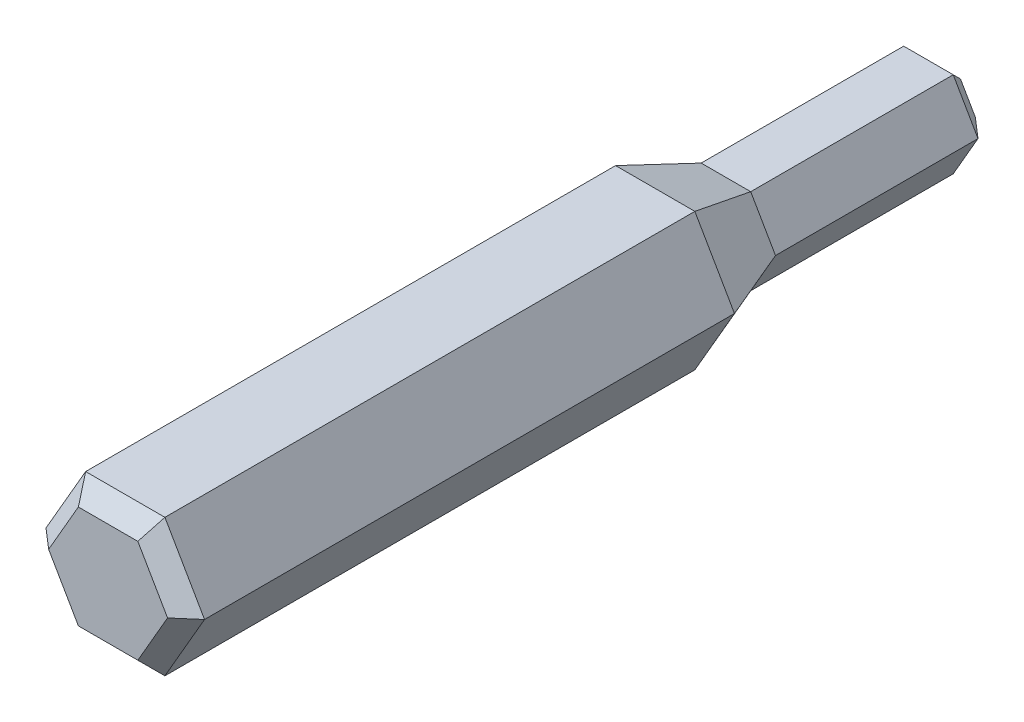
ISO-10303-21;
HEADER;
FILE_DESCRIPTION(('STEP AP214'),'2;1');
FILE_NAME('part.step','',(''),(''),'','','');
FILE_SCHEMA(('AUTOMOTIVE_DESIGN { 1 0 10303 214 1 1 1 1 }'));
ENDSEC;
DATA;
#1=APPLICATION_CONTEXT('core data for automotive mechanical design processes');
#2=APPLICATION_PROTOCOL_DEFINITION('international standard','automotive_design',2000,#1);
#3=PRODUCT_CONTEXT('',#1,'mechanical');
#4=PRODUCT('Part','Part','',(#3));
#5=PRODUCT_RELATED_PRODUCT_CATEGORY('part','',(#4));
#6=PRODUCT_DEFINITION_FORMATION('','',#4);
#7=PRODUCT_DEFINITION_CONTEXT('part definition',#1,'design');
#8=PRODUCT_DEFINITION('design','',#6,#7);
#9=PRODUCT_DEFINITION_SHAPE('','',#8);
#10=(LENGTH_UNIT() NAMED_UNIT(*) SI_UNIT(.MILLI.,.METRE.));
#11=(NAMED_UNIT(*) PLANE_ANGLE_UNIT() SI_UNIT($,.RADIAN.));
#12=(NAMED_UNIT(*) SI_UNIT($,.STERADIAN.) SOLID_ANGLE_UNIT());
#13=UNCERTAINTY_MEASURE_WITH_UNIT(LENGTH_MEASURE(1.E-05),#10,'distance_accuracy_value','');
#14=(GEOMETRIC_REPRESENTATION_CONTEXT(3) GLOBAL_UNCERTAINTY_ASSIGNED_CONTEXT((#13)) GLOBAL_UNIT_ASSIGNED_CONTEXT((#10,
#11,#12)) REPRESENTATION_CONTEXT('',''));
#15=CARTESIAN_POINT('',(0.,0.,0.));
#16=DIRECTION('',(0.,0.,1.));
#17=DIRECTION('',(1.,0.,0.));
#18=AXIS2_PLACEMENT_3D('',#15,#16,#17);
#19=CARTESIAN_POINT('',(1.15470053837927,-1.99999999999998,18.));
#20=DIRECTION('',(-0.866025403784441,0.499999999999995,0.));
#21=DIRECTION('',(-0.499999999999995,-0.866025403784441,0.));
#22=AXIS2_PLACEMENT_3D('',#19,#20,#21);
#23=PLANE('',#22);
#24=DIRECTION('',(0.,0.,-1.));
#25=VECTOR('',#24,1.);
#26=CARTESIAN_POINT('',(1.15470053837927,-1.99999999999998,18.));
#27=LINE('',#26,#25);
#28=CARTESIAN_POINT('',(1.15470053837927,-1.99999999999998,17.5));
#29=VERTEX_POINT('',#28);
#30=CARTESIAN_POINT('',(1.15470053837927,-1.99999999999998,2.06060806459097));
#31=VERTEX_POINT('',#30);
#32=EDGE_CURVE('E219',#29,#31,#27,.T.);
#33=ORIENTED_EDGE('',*,*,#32,.T.);
#34=DIRECTION('',(0.499999999999995,0.866025403784441,0.));
#35=VECTOR('',#34,1.);
#36=CARTESIAN_POINT('',(1.15470053837927,-1.99999999999998,2.06060806459097));
#37=LINE('',#36,#35);
#38=CARTESIAN_POINT('',(2.30940107675849,0.,2.06060806459097));
#39=VERTEX_POINT('',#38);
#40=EDGE_CURVE('E283',#31,#39,#37,.T.);
#41=ORIENTED_EDGE('',*,*,#40,.T.);
#42=DIRECTION('',(0.,0.,-1.));
#43=VECTOR('',#42,1.);
#44=CARTESIAN_POINT('',(2.30940107675849,0.,18.));
#45=LINE('',#44,#43);
#46=CARTESIAN_POINT('',(2.30940107675849,0.,17.5));
#47=VERTEX_POINT('',#46);
#48=EDGE_CURVE('E235',#47,#39,#45,.T.);
#49=ORIENTED_EDGE('',*,*,#48,.F.);
#50=DIRECTION('',(-0.499999999999995,-0.866025403784441,0.));
#51=VECTOR('',#50,1.);
#52=CARTESIAN_POINT('',(1.15470053837927,-1.99999999999998,17.5));
#53=LINE('',#52,#51);
#54=EDGE_CURVE('E262',#47,#29,#53,.T.);
#55=ORIENTED_EDGE('',*,*,#54,.T.);
#56=EDGE_LOOP('',(#33,#41,#49,#55));
#57=FACE_BOUND('',#56,.T.);
#58=ADVANCED_FACE('F38',(#57),#23,.F.);
#59=CARTESIAN_POINT('',(2.30940107675849,0.,18.));
#60=DIRECTION('',(-0.866025403784438,-0.500000000000001,0.));
#61=DIRECTION('',(0.500000000000001,-0.866025403784438,0.));
#62=AXIS2_PLACEMENT_3D('',#59,#60,#61);
#63=PLANE('',#62);
#64=ORIENTED_EDGE('',*,*,#48,.T.);
#65=DIRECTION('',(-0.500000000000001,0.866025403784438,0.));
#66=VECTOR('',#65,1.);
#67=CARTESIAN_POINT('',(2.30940107675849,0.,2.06060806459097));
#68=LINE('',#67,#66);
#69=CARTESIAN_POINT('',(1.15470053837924,2.,2.06060806459097));
#70=VERTEX_POINT('',#69);
#71=EDGE_CURVE('E285',#39,#70,#68,.T.);
#72=ORIENTED_EDGE('',*,*,#71,.T.);
#73=DIRECTION('',(0.,0.,-1.));
#74=VECTOR('',#73,1.);
#75=CARTESIAN_POINT('',(1.15470053837924,2.,18.));
#76=LINE('',#75,#74);
#77=CARTESIAN_POINT('',(1.15470053837924,2.,17.5));
#78=VERTEX_POINT('',#77);
#79=EDGE_CURVE('E232',#78,#70,#76,.T.);
#80=ORIENTED_EDGE('',*,*,#79,.F.);
#81=DIRECTION('',(0.500000000000001,-0.866025403784438,0.));
#82=VECTOR('',#81,1.);
#83=CARTESIAN_POINT('',(2.30940107675849,0.,17.5));
#84=LINE('',#83,#82);
#85=EDGE_CURVE('E260',#78,#47,#84,.T.);
#86=ORIENTED_EDGE('',*,*,#85,.T.);
#87=EDGE_LOOP('',(#64,#72,#80,#86));
#88=FACE_BOUND('',#87,.T.);
#89=ADVANCED_FACE('F382',(#88),#63,.F.);
#90=CARTESIAN_POINT('',(1.15470053837924,2.,18.));
#91=DIRECTION('',(0.,-1.,0.));
#92=DIRECTION('',(1.,0.,0.));
#93=AXIS2_PLACEMENT_3D('',#90,#91,#92);
#94=PLANE('',#93);
#95=ORIENTED_EDGE('',*,*,#79,.T.);
#96=DIRECTION('',(-1.,0.,0.));
#97=VECTOR('',#96,1.);
#98=CARTESIAN_POINT('',(1.15470053837924,2.,2.06060806459097));
#99=LINE('',#98,#97);
#100=CARTESIAN_POINT('',(-1.15470053837926,1.99999999999999,2.06060806459097));
#101=VERTEX_POINT('',#100);
#102=EDGE_CURVE('E287',#70,#101,#99,.T.);
#103=ORIENTED_EDGE('',*,*,#102,.T.);
#104=DIRECTION('',(0.,0.,-1.));
#105=VECTOR('',#104,1.);
#106=CARTESIAN_POINT('',(-1.15470053837926,1.99999999999999,18.));
#107=LINE('',#106,#105);
#108=CARTESIAN_POINT('',(-1.15470053837926,1.99999999999999,17.5));
#109=VERTEX_POINT('',#108);
#110=EDGE_CURVE('E229',#109,#101,#107,.T.);
#111=ORIENTED_EDGE('',*,*,#110,.F.);
#112=DIRECTION('',(1.,0.,0.));
#113=VECTOR('',#112,1.);
#114=CARTESIAN_POINT('',(1.15470053837924,2.,17.5));
#115=LINE('',#114,#113);
#116=EDGE_CURVE('E258',#109,#78,#115,.T.);
#117=ORIENTED_EDGE('',*,*,#116,.T.);
#118=EDGE_LOOP('',(#95,#103,#111,#117));
#119=FACE_BOUND('',#118,.T.);
#120=ADVANCED_FACE('F386',(#119),#94,.F.);
#121=CARTESIAN_POINT('',(-1.15470053837926,1.99999999999999,18.));
#122=DIRECTION('',(0.866025403784442,-0.499999999999995,0.));
#123=DIRECTION('',(0.499999999999995,0.866025403784442,0.));
#124=AXIS2_PLACEMENT_3D('',#121,#122,#123);
#125=PLANE('',#124);
#126=ORIENTED_EDGE('',*,*,#110,.T.);
#127=DIRECTION('',(-0.499999999999995,-0.866025403784442,0.));
#128=VECTOR('',#127,1.);
#129=CARTESIAN_POINT('',(-1.15470053837926,1.99999999999999,2.06060806459097));
#130=LINE('',#129,#128);
#131=CARTESIAN_POINT('',(-2.30940107675849,0.,2.06060806459097));
#132=VERTEX_POINT('',#131);
#133=EDGE_CURVE('E183',#101,#132,#130,.T.);
#134=ORIENTED_EDGE('',*,*,#133,.T.);
#135=DIRECTION('',(0.,0.,-1.));
#136=VECTOR('',#135,1.);
#137=CARTESIAN_POINT('',(-2.30940107675849,0.,18.));
#138=LINE('',#137,#136);
#139=CARTESIAN_POINT('',(-2.30940107675849,0.,17.5));
#140=VERTEX_POINT('',#139);
#141=EDGE_CURVE('E226',#140,#132,#138,.T.);
#142=ORIENTED_EDGE('',*,*,#141,.F.);
#143=DIRECTION('',(0.499999999999995,0.866025403784442,0.));
#144=VECTOR('',#143,1.);
#145=CARTESIAN_POINT('',(-1.15470053837926,1.99999999999999,17.5));
#146=LINE('',#145,#144);
#147=EDGE_CURVE('E256',#140,#109,#146,.T.);
#148=ORIENTED_EDGE('',*,*,#147,.T.);
#149=EDGE_LOOP('',(#126,#134,#142,#148));
#150=FACE_BOUND('',#149,.T.);
#151=ADVANCED_FACE('F421',(#150),#125,.F.);
#152=CARTESIAN_POINT('',(-2.30940107675849,0.,18.));
#153=DIRECTION('',(0.866025403784435,0.500000000000007,0.));
#154=DIRECTION('',(-0.500000000000007,0.866025403784435,0.));
#155=AXIS2_PLACEMENT_3D('',#152,#153,#154);
#156=PLANE('',#155);
#157=ORIENTED_EDGE('',*,*,#141,.T.);
#158=DIRECTION('',(0.500000000000007,-0.866025403784435,0.));
#159=VECTOR('',#158,1.);
#160=CARTESIAN_POINT('',(-2.30940107675849,0.,2.06060806459097));
#161=LINE('',#160,#159);
#162=CARTESIAN_POINT('',(-1.15470053837923,-2.,2.06060806459097));
#163=VERTEX_POINT('',#162);
#164=EDGE_CURVE('E279',#132,#163,#161,.T.);
#165=ORIENTED_EDGE('',*,*,#164,.T.);
#166=DIRECTION('',(0.,0.,-1.));
#167=VECTOR('',#166,1.);
#168=CARTESIAN_POINT('',(-1.15470053837923,-2.,18.));
#169=LINE('',#168,#167);
#170=CARTESIAN_POINT('',(-1.15470053837923,-2.,17.5));
#171=VERTEX_POINT('',#170);
#172=EDGE_CURVE('E222',#171,#163,#169,.T.);
#173=ORIENTED_EDGE('',*,*,#172,.F.);
#174=DIRECTION('',(-0.500000000000007,0.866025403784435,0.));
#175=VECTOR('',#174,1.);
#176=CARTESIAN_POINT('',(-2.30940107675849,0.,17.5));
#177=LINE('',#176,#175);
#178=EDGE_CURVE('E254',#171,#140,#177,.T.);
#179=ORIENTED_EDGE('',*,*,#178,.T.);
#180=EDGE_LOOP('',(#157,#165,#173,#179));
#181=FACE_BOUND('',#180,.T.);
#182=ADVANCED_FACE('F422',(#181),#156,.F.);
#183=CARTESIAN_POINT('',(-1.15470053837923,-2.,18.));
#184=DIRECTION('',(0.,1.,0.));
#185=DIRECTION('',(-1.,0.,0.));
#186=AXIS2_PLACEMENT_3D('',#183,#184,#185);
#187=PLANE('',#186);
#188=ORIENTED_EDGE('',*,*,#172,.T.);
#189=DIRECTION('',(1.,0.,0.));
#190=VECTOR('',#189,1.);
#191=CARTESIAN_POINT('',(-1.15470053837923,-2.,2.06060806459097));
#192=LINE('',#191,#190);
#193=EDGE_CURVE('E281',#163,#31,#192,.T.);
#194=ORIENTED_EDGE('',*,*,#193,.T.);
#195=ORIENTED_EDGE('',*,*,#32,.F.);
#196=DIRECTION('',(-1.,0.,0.));
#197=VECTOR('',#196,1.);
#198=CARTESIAN_POINT('',(-1.15470053837923,-2.,17.5));
#199=LINE('',#198,#197);
#200=EDGE_CURVE('E251',#29,#171,#199,.T.);
#201=ORIENTED_EDGE('',*,*,#200,.T.);
#202=EDGE_LOOP('',(#188,#194,#195,#201));
#203=FACE_BOUND('',#202,.T.);
#204=ADVANCED_FACE('F429',(#203),#187,.F.);
#205=CARTESIAN_POINT('',(0.,0.,18.));
#206=DIRECTION('',(0.,0.,1.));
#207=DIRECTION('',(1.,0.,0.));
#208=AXIS2_PLACEMENT_3D('',#205,#206,#207);
#209=PLANE('',#208);
#210=DIRECTION('',(0.500000000000007,-0.866025403784435,0.));
#211=VECTOR('',#210,1.);
#212=CARTESIAN_POINT('',(-0.721687836487011,-1.75,18.));
#213=LINE('',#212,#211);
#214=CARTESIAN_POINT('',(-1.73205080756887,0.,18.));
#215=VERTEX_POINT('',#214);
#216=CARTESIAN_POINT('',(-0.86602540378442,-1.5,18.));
#217=VERTEX_POINT('',#216);
#218=EDGE_CURVE('E246',#215,#217,#213,.T.);
#219=ORIENTED_EDGE('',*,*,#218,.T.);
#220=DIRECTION('',(1.,0.,0.));
#221=VECTOR('',#220,1.);
#222=CARTESIAN_POINT('',(1.15470053837927,-1.49999999999998,18.));
#223=LINE('',#222,#221);
#224=CARTESIAN_POINT('',(0.866025403784454,-1.49999999999998,18.));
#225=VERTEX_POINT('',#224);
#226=EDGE_CURVE('E248',#217,#225,#223,.T.);
#227=ORIENTED_EDGE('',*,*,#226,.T.);
#228=DIRECTION('',(0.499999999999995,0.866025403784441,0.));
#229=VECTOR('',#228,1.);
#230=CARTESIAN_POINT('',(1.87638837486627,0.249999999999998,18.));
#231=LINE('',#230,#229);
#232=CARTESIAN_POINT('',(1.73205080756887,0.,18.));
#233=VERTEX_POINT('',#232);
#234=EDGE_CURVE('E238',#225,#233,#231,.T.);
#235=ORIENTED_EDGE('',*,*,#234,.T.);
#236=DIRECTION('',(-0.500000000000001,0.866025403784438,0.));
#237=VECTOR('',#236,1.);
#238=CARTESIAN_POINT('',(0.721687836487023,1.74999999999999,18.));
#239=LINE('',#238,#237);
#240=CARTESIAN_POINT('',(0.866025403784431,1.49999999999999,18.));
#241=VERTEX_POINT('',#240);
#242=EDGE_CURVE('E240',#233,#241,#239,.T.);
#243=ORIENTED_EDGE('',*,*,#242,.T.);
#244=DIRECTION('',(-1.,0.,0.));
#245=VECTOR('',#244,1.);
#246=CARTESIAN_POINT('',(-1.15470053837925,1.49999999999999,18.));
#247=LINE('',#246,#245);
#248=CARTESIAN_POINT('',(-0.866025403784441,1.49999999999999,18.));
#249=VERTEX_POINT('',#248);
#250=EDGE_CURVE('E242',#241,#249,#247,.T.);
#251=ORIENTED_EDGE('',*,*,#250,.T.);
#252=DIRECTION('',(-0.499999999999995,-0.866025403784442,0.));
#253=VECTOR('',#252,1.);
#254=CARTESIAN_POINT('',(-1.87638837486627,-0.250000000000014,18.));
#255=LINE('',#254,#253);
#256=EDGE_CURVE('E244',#249,#215,#255,.T.);
#257=ORIENTED_EDGE('',*,*,#256,.T.);
#258=EDGE_LOOP('',(#219,#227,#235,#243,#251,#257));
#259=FACE_BOUND('',#258,.T.);
#260=ADVANCED_FACE('F401',(#259),#209,.T.);
#261=CARTESIAN_POINT('',(0.,1.49999999999999,18.));
#262=DIRECTION('',(0.,0.70710678118655,0.707106781186545));
#263=DIRECTION('',(1.,0.,0.));
#264=AXIS2_PLACEMENT_3D('',#261,#262,#263);
#265=PLANE('',#264);
#266=DIRECTION('',(-0.377964473009225,-0.654653670707976,0.654653670707979));
#267=VECTOR('',#266,1.);
#268=CARTESIAN_POINT('',(0.742307488958083,1.28571428571428,18.2142857142857));
#269=LINE('',#268,#267);
#270=EDGE_CURVE('E273',#78,#241,#269,.T.);
#271=ORIENTED_EDGE('',*,*,#270,.F.);
#272=ORIENTED_EDGE('',*,*,#116,.F.);
#273=DIRECTION('',(0.377964473009229,-0.654653670707974,0.654653670707979));
#274=VECTOR('',#273,1.);
#275=CARTESIAN_POINT('',(-0.742307488958093,1.28571428571428,18.2142857142857));
#276=LINE('',#275,#274);
#277=EDGE_CURVE('E223',#249,#109,#276,.F.);
#278=ORIENTED_EDGE('',*,*,#277,.F.);
#279=ORIENTED_EDGE('',*,*,#250,.F.);
#280=EDGE_LOOP('',(#271,#272,#278,#279));
#281=FACE_BOUND('',#280,.T.);
#282=ADVANCED_FACE('F391',(#281),#265,.T.);
#283=CARTESIAN_POINT('',(-1.29903810567665,0.749999999999988,18.));
#284=DIRECTION('',(-0.612372435695799,0.353553390593271,0.707106781186545));
#285=DIRECTION('',(0.499999999999995,0.866025403784442,0.));
#286=AXIS2_PLACEMENT_3D('',#283,#284,#285);
#287=PLANE('',#286);
#288=ORIENTED_EDGE('',*,*,#277,.T.);
#289=ORIENTED_EDGE('',*,*,#147,.F.);
#290=DIRECTION('',(0.755928946018453,0.,0.65465367070798));
#291=VECTOR('',#290,1.);
#292=CARTESIAN_POINT('',(-1.48461497791617,0.,18.2142857142857));
#293=LINE('',#292,#291);
#294=EDGE_CURVE('E270',#215,#140,#293,.F.);
#295=ORIENTED_EDGE('',*,*,#294,.F.);
#296=ORIENTED_EDGE('',*,*,#256,.F.);
#297=EDGE_LOOP('',(#288,#289,#295,#296));
#298=FACE_BOUND('',#297,.T.);
#299=ADVANCED_FACE('F397',(#298),#287,.T.);
#300=CARTESIAN_POINT('',(1.29903810567665,0.749999999999997,18.));
#301=DIRECTION('',(0.612372435695796,0.353553390593275,0.707106781186545));
#302=DIRECTION('',(0.500000000000001,-0.866025403784438,0.));
#303=AXIS2_PLACEMENT_3D('',#300,#301,#302);
#304=PLANE('',#303);
#305=ORIENTED_EDGE('',*,*,#270,.T.);
#306=ORIENTED_EDGE('',*,*,#242,.F.);
#307=DIRECTION('',(-0.755928946018452,0.,0.65465367070798));
#308=VECTOR('',#307,1.);
#309=CARTESIAN_POINT('',(1.48461497791618,0.,18.2142857142857));
#310=LINE('',#309,#308);
#311=EDGE_CURVE('E267',#47,#233,#310,.T.);
#312=ORIENTED_EDGE('',*,*,#311,.F.);
#313=ORIENTED_EDGE('',*,*,#85,.F.);
#314=EDGE_LOOP('',(#305,#306,#312,#313));
#315=FACE_BOUND('',#314,.T.);
#316=ADVANCED_FACE('F405',(#315),#304,.T.);
#317=CARTESIAN_POINT('',(-1.29903810567664,-0.750000000000006,18.));
#318=DIRECTION('',(-0.612372435695793,-0.35355339059328,0.707106781186545));
#319=DIRECTION('',(-0.500000000000007,0.866025403784435,0.));
#320=AXIS2_PLACEMENT_3D('',#317,#318,#319);
#321=PLANE('',#320);
#322=ORIENTED_EDGE('',*,*,#294,.T.);
#323=ORIENTED_EDGE('',*,*,#178,.F.);
#324=DIRECTION('',(0.37796447300922,0.654653670707979,0.654653670707979));
#325=VECTOR('',#324,1.);
#326=CARTESIAN_POINT('',(-0.742307488958074,-1.28571428571429,18.2142857142857));
#327=LINE('',#326,#325);
#328=EDGE_CURVE('E265',#217,#171,#327,.F.);
#329=ORIENTED_EDGE('',*,*,#328,.F.);
#330=ORIENTED_EDGE('',*,*,#218,.F.);
#331=EDGE_LOOP('',(#322,#323,#329,#330));
#332=FACE_BOUND('',#331,.T.);
#333=ADVANCED_FACE('F425',(#332),#321,.T.);
#334=CARTESIAN_POINT('',(1.29903810567666,-0.749999999999992,18.));
#335=DIRECTION('',(0.612372435695799,-0.353553390593272,0.707106781186545));
#336=DIRECTION('',(-0.499999999999995,-0.866025403784441,0.));
#337=AXIS2_PLACEMENT_3D('',#334,#335,#336);
#338=PLANE('',#337);
#339=ORIENTED_EDGE('',*,*,#311,.T.);
#340=ORIENTED_EDGE('',*,*,#234,.F.);
#341=DIRECTION('',(0.377964473009231,-0.654653670707972,-0.65465367070798));
#342=VECTOR('',#341,1.);
#343=CARTESIAN_POINT('',(0.742307488958107,-1.28571428571427,18.2142857142857));
#344=LINE('',#343,#342);
#345=EDGE_CURVE('E218',#29,#225,#344,.F.);
#346=ORIENTED_EDGE('',*,*,#345,.F.);
#347=ORIENTED_EDGE('',*,*,#54,.F.);
#348=EDGE_LOOP('',(#339,#340,#346,#347));
#349=FACE_BOUND('',#348,.T.);
#350=ADVANCED_FACE('F435',(#349),#338,.T.);
#351=CARTESIAN_POINT('',(0.,-1.49999999999999,18.));
#352=DIRECTION('',(0.,-0.70710678118655,0.707106781186545));
#353=DIRECTION('',(-1.,0.,0.));
#354=AXIS2_PLACEMENT_3D('',#351,#352,#353);
#355=PLANE('',#354);
#356=ORIENTED_EDGE('',*,*,#328,.T.);
#357=ORIENTED_EDGE('',*,*,#200,.F.);
#358=ORIENTED_EDGE('',*,*,#345,.T.);
#359=ORIENTED_EDGE('',*,*,#226,.F.);
#360=EDGE_LOOP('',(#356,#357,#358,#359));
#361=FACE_BOUND('',#360,.T.);
#362=ADVANCED_FACE('F432',(#361),#355,.T.);
#363=CARTESIAN_POINT('',(-0.721687836487031,-1.25,-6.4));
#364=DIRECTION('',(0.866025403784439,0.499999999999999,0.));
#365=DIRECTION('',(-0.499999999999999,0.866025403784439,0.));
#366=AXIS2_PLACEMENT_3D('',#363,#364,#365);
#367=PLANE('',#366);
#368=DIRECTION('',(0.,0.,1.));
#369=VECTOR('',#368,1.);
#370=CARTESIAN_POINT('',(-1.44337567297406,0.,-6.4));
#371=LINE('',#370,#369);
#372=CARTESIAN_POINT('',(-1.44337567297406,0.,-5.9));
#373=VERTEX_POINT('',#372);
#374=CARTESIAN_POINT('',(-1.44337567297406,0.,0.));
#375=VERTEX_POINT('',#374);
#376=EDGE_CURVE('E171',#373,#375,#371,.T.);
#377=ORIENTED_EDGE('',*,*,#376,.F.);
#378=DIRECTION('',(0.499999999999999,-0.866025403784439,0.));
#379=VECTOR('',#378,1.);
#380=CARTESIAN_POINT('',(-0.721687836487031,-1.25,-5.9));
#381=LINE('',#380,#379);
#382=CARTESIAN_POINT('',(-0.721687836487031,-1.25,-5.9));
#383=VERTEX_POINT('',#382);
#384=EDGE_CURVE('E11',#373,#383,#381,.T.);
#385=ORIENTED_EDGE('',*,*,#384,.T.);
#386=DIRECTION('',(0.,0.,1.));
#387=VECTOR('',#386,1.);
#388=CARTESIAN_POINT('',(-0.721687836487031,-1.25,-6.4));
#389=LINE('',#388,#387);
#390=CARTESIAN_POINT('',(-0.721687836487031,-1.25,0.));
#391=VERTEX_POINT('',#390);
#392=EDGE_CURVE('E210',#383,#391,#389,.T.);
#393=ORIENTED_EDGE('',*,*,#392,.T.);
#394=DIRECTION('',(-0.499999999999999,0.866025403784439,0.));
#395=VECTOR('',#394,1.);
#396=CARTESIAN_POINT('',(-0.721687836487031,-1.25,0.));
#397=LINE('',#396,#395);
#398=EDGE_CURVE('E197',#391,#375,#397,.T.);
#399=ORIENTED_EDGE('',*,*,#398,.T.);
#400=EDGE_LOOP('',(#377,#385,#393,#399));
#401=FACE_BOUND('',#400,.T.);
#402=ADVANCED_FACE('F351',(#401),#367,.F.);
#403=CARTESIAN_POINT('',(-1.44337567297406,0.,-6.4));
#404=DIRECTION('',(0.866025403784438,-0.5,0.));
#405=DIRECTION('',(0.5,0.866025403784439,0.));
#406=AXIS2_PLACEMENT_3D('',#403,#404,#405);
#407=PLANE('',#406);
#408=DIRECTION('',(0.,0.,1.));
#409=VECTOR('',#408,1.);
#410=CARTESIAN_POINT('',(-0.721687836487032,1.25,-6.4));
#411=LINE('',#410,#409);
#412=CARTESIAN_POINT('',(-0.721687836487032,1.25,-5.9));
#413=VERTEX_POINT('',#412);
#414=CARTESIAN_POINT('',(-0.721687836487032,1.25,0.));
#415=VERTEX_POINT('',#414);
#416=EDGE_CURVE('E163',#413,#415,#411,.T.);
#417=ORIENTED_EDGE('',*,*,#416,.F.);
#418=DIRECTION('',(-0.5,-0.866025403784439,0.));
#419=VECTOR('',#418,1.);
#420=CARTESIAN_POINT('',(-1.44337567297406,0.,-5.9));
#421=LINE('',#420,#419);
#422=EDGE_CURVE('E48',#413,#373,#421,.T.);
#423=ORIENTED_EDGE('',*,*,#422,.T.);
#424=ORIENTED_EDGE('',*,*,#376,.T.);
#425=DIRECTION('',(0.5,0.866025403784438,0.));
#426=VECTOR('',#425,1.);
#427=CARTESIAN_POINT('',(-1.44337567297406,0.,0.));
#428=LINE('',#427,#426);
#429=EDGE_CURVE('E180',#375,#415,#428,.T.);
#430=ORIENTED_EDGE('',*,*,#429,.T.);
#431=EDGE_LOOP('',(#417,#423,#424,#430));
#432=FACE_BOUND('',#431,.T.);
#433=ADVANCED_FACE('F195',(#432),#407,.F.);
#434=CARTESIAN_POINT('',(-0.721687836487032,1.25,-6.4));
#435=DIRECTION('',(0.,-1.,0.));
#436=DIRECTION('',(1.,0.,0.));
#437=AXIS2_PLACEMENT_3D('',#434,#435,#436);
#438=PLANE('',#437);
#439=DIRECTION('',(0.,0.,1.));
#440=VECTOR('',#439,1.);
#441=CARTESIAN_POINT('',(0.721687836487031,1.25,-6.4));
#442=LINE('',#441,#440);
#443=CARTESIAN_POINT('',(0.721687836487031,1.25,-5.9));
#444=VERTEX_POINT('',#443);
#445=CARTESIAN_POINT('',(0.721687836487031,1.25,0.));
#446=VERTEX_POINT('',#445);
#447=EDGE_CURVE('E172',#444,#446,#442,.T.);
#448=ORIENTED_EDGE('',*,*,#447,.F.);
#449=DIRECTION('',(-1.,0.,0.));
#450=VECTOR('',#449,1.);
#451=CARTESIAN_POINT('',(-0.721687836487032,1.25,-5.9));
#452=LINE('',#451,#450);
#453=EDGE_CURVE('E63',#444,#413,#452,.T.);
#454=ORIENTED_EDGE('',*,*,#453,.T.);
#455=ORIENTED_EDGE('',*,*,#416,.T.);
#456=DIRECTION('',(1.,0.,0.));
#457=VECTOR('',#456,1.);
#458=CARTESIAN_POINT('',(-0.721687836487032,1.25,0.));
#459=LINE('',#458,#457);
#460=EDGE_CURVE('E167',#415,#446,#459,.T.);
#461=ORIENTED_EDGE('',*,*,#460,.T.);
#462=EDGE_LOOP('',(#448,#454,#455,#461));
#463=FACE_BOUND('',#462,.T.);
#464=ADVANCED_FACE('F165',(#463),#438,.F.);
#465=CARTESIAN_POINT('',(0.721687836487031,1.25,-6.4));
#466=DIRECTION('',(-0.866025403784439,-0.5,0.));
#467=DIRECTION('',(0.5,-0.866025403784439,0.));
#468=AXIS2_PLACEMENT_3D('',#465,#466,#467);
#469=PLANE('',#468);
#470=DIRECTION('',(0.,0.,1.));
#471=VECTOR('',#470,1.);
#472=CARTESIAN_POINT('',(1.44337567297406,0.,-6.4));
#473=LINE('',#472,#471);
#474=CARTESIAN_POINT('',(1.44337567297406,0.,-5.9));
#475=VERTEX_POINT('',#474);
#476=CARTESIAN_POINT('',(1.44337567297406,0.,0.));
#477=VERTEX_POINT('',#476);
#478=EDGE_CURVE('E214',#475,#477,#473,.T.);
#479=ORIENTED_EDGE('',*,*,#478,.F.);
#480=DIRECTION('',(-0.5,0.866025403784439,0.));
#481=VECTOR('',#480,1.);
#482=CARTESIAN_POINT('',(0.721687836487031,1.25,-5.9));
#483=LINE('',#482,#481);
#484=EDGE_CURVE('E316',#475,#444,#483,.T.);
#485=ORIENTED_EDGE('',*,*,#484,.T.);
#486=ORIENTED_EDGE('',*,*,#447,.T.);
#487=DIRECTION('',(0.5,-0.866025403784439,0.));
#488=VECTOR('',#487,1.);
#489=CARTESIAN_POINT('',(0.721687836487031,1.25,0.));
#490=LINE('',#489,#488);
#491=EDGE_CURVE('E193',#446,#477,#490,.T.);
#492=ORIENTED_EDGE('',*,*,#491,.T.);
#493=EDGE_LOOP('',(#479,#485,#486,#492));
#494=FACE_BOUND('',#493,.T.);
#495=ADVANCED_FACE('F370',(#494),#469,.F.);
#496=CARTESIAN_POINT('',(1.44337567297406,0.,-6.4));
#497=DIRECTION('',(-0.866025403784438,0.5,0.));
#498=DIRECTION('',(-0.5,-0.866025403784438,0.));
#499=AXIS2_PLACEMENT_3D('',#496,#497,#498);
#500=PLANE('',#499);
#501=DIRECTION('',(0.,0.,1.));
#502=VECTOR('',#501,1.);
#503=CARTESIAN_POINT('',(0.721687836487029,-1.25,-6.4));
#504=LINE('',#503,#502);
#505=CARTESIAN_POINT('',(0.721687836487029,-1.25,-5.9));
#506=VERTEX_POINT('',#505);
#507=CARTESIAN_POINT('',(0.721687836487029,-1.25,0.));
#508=VERTEX_POINT('',#507);
#509=EDGE_CURVE('E212',#506,#508,#504,.T.);
#510=ORIENTED_EDGE('',*,*,#509,.F.);
#511=DIRECTION('',(0.5,0.866025403784438,0.));
#512=VECTOR('',#511,1.);
#513=CARTESIAN_POINT('',(1.44337567297406,0.,-5.9));
#514=LINE('',#513,#512);
#515=EDGE_CURVE('E314',#506,#475,#514,.T.);
#516=ORIENTED_EDGE('',*,*,#515,.T.);
#517=ORIENTED_EDGE('',*,*,#478,.T.);
#518=DIRECTION('',(-0.5,-0.866025403784439,0.));
#519=VECTOR('',#518,1.);
#520=CARTESIAN_POINT('',(1.44337567297406,0.,0.));
#521=LINE('',#520,#519);
#522=EDGE_CURVE('E204',#477,#508,#521,.T.);
#523=ORIENTED_EDGE('',*,*,#522,.T.);
#524=EDGE_LOOP('',(#510,#516,#517,#523));
#525=FACE_BOUND('',#524,.T.);
#526=ADVANCED_FACE('F368',(#525),#500,.F.);
#527=CARTESIAN_POINT('',(0.721687836487029,-1.25,-6.4));
#528=DIRECTION('',(0.,1.,0.));
#529=DIRECTION('',(-1.,0.,0.));
#530=AXIS2_PLACEMENT_3D('',#527,#528,#529);
#531=PLANE('',#530);
#532=ORIENTED_EDGE('',*,*,#392,.F.);
#533=DIRECTION('',(1.,0.,0.));
#534=VECTOR('',#533,1.);
#535=CARTESIAN_POINT('',(0.721687836487029,-1.25,-5.9));
#536=LINE('',#535,#534);
#537=EDGE_CURVE('E311',#383,#506,#536,.T.);
#538=ORIENTED_EDGE('',*,*,#537,.T.);
#539=ORIENTED_EDGE('',*,*,#509,.T.);
#540=DIRECTION('',(-1.,0.,0.));
#541=VECTOR('',#540,1.);
#542=CARTESIAN_POINT('',(0.721687836487029,-1.25,0.));
#543=LINE('',#542,#541);
#544=EDGE_CURVE('E207',#508,#391,#543,.T.);
#545=ORIENTED_EDGE('',*,*,#544,.T.);
#546=EDGE_LOOP('',(#532,#538,#539,#545));
#547=FACE_BOUND('',#546,.T.);
#548=ADVANCED_FACE('F354',(#547),#531,.F.);
#549=CARTESIAN_POINT('',(0.,0.,-6.4));
#550=DIRECTION('',(0.,0.,-1.));
#551=DIRECTION('',(-1.,0.,0.));
#552=AXIS2_PLACEMENT_3D('',#549,#550,#551);
#553=PLANE('',#552);
#554=DIRECTION('',(-0.5,-0.866025403784438,0.));
#555=VECTOR('',#554,1.);
#556=CARTESIAN_POINT('',(0.288675134594813,-1.,-6.4));
#557=LINE('',#556,#555);
#558=CARTESIAN_POINT('',(0.866025403784442,0.,-6.4));
#559=VERTEX_POINT('',#558);
#560=CARTESIAN_POINT('',(0.433012701892219,-0.750000000000006,-6.4));
#561=VERTEX_POINT('',#560);
#562=EDGE_CURVE('E306',#559,#561,#557,.T.);
#563=ORIENTED_EDGE('',*,*,#562,.T.);
#564=DIRECTION('',(-1.,0.,0.));
#565=VECTOR('',#564,1.);
#566=CARTESIAN_POINT('',(-0.721687836487031,-0.750000000000006,-6.4));
#567=LINE('',#566,#565);
#568=CARTESIAN_POINT('',(-0.433012701892221,-0.750000000000006,-6.4));
#569=VERTEX_POINT('',#568);
#570=EDGE_CURVE('E308',#561,#569,#567,.T.);
#571=ORIENTED_EDGE('',*,*,#570,.T.);
#572=DIRECTION('',(-0.499999999999999,0.866025403784439,0.));
#573=VECTOR('',#572,1.);
#574=CARTESIAN_POINT('',(-1.01036297108185,0.249999999999999,-6.4));
#575=LINE('',#574,#573);
#576=CARTESIAN_POINT('',(-0.866025403784443,0.,-6.4));
#577=VERTEX_POINT('',#576);
#578=EDGE_CURVE('E289',#569,#577,#575,.T.);
#579=ORIENTED_EDGE('',*,*,#578,.T.);
#580=DIRECTION('',(0.5,0.866025403784439,0.));
#581=VECTOR('',#580,1.);
#582=CARTESIAN_POINT('',(-0.288675134594816,1.,-6.4));
#583=LINE('',#582,#581);
#584=CARTESIAN_POINT('',(-0.433012701892222,0.750000000000005,-6.4));
#585=VERTEX_POINT('',#584);
#586=EDGE_CURVE('E300',#577,#585,#583,.T.);
#587=ORIENTED_EDGE('',*,*,#586,.T.);
#588=DIRECTION('',(1.,0.,0.));
#589=VECTOR('',#588,1.);
#590=CARTESIAN_POINT('',(0.721687836487031,0.750000000000004,-6.4));
#591=LINE('',#590,#589);
#592=CARTESIAN_POINT('',(0.43301270189222,0.750000000000004,-6.4));
#593=VERTEX_POINT('',#592);
#594=EDGE_CURVE('E302',#585,#593,#591,.T.);
#595=ORIENTED_EDGE('',*,*,#594,.T.);
#596=DIRECTION('',(0.5,-0.866025403784439,0.));
#597=VECTOR('',#596,1.);
#598=CARTESIAN_POINT('',(1.01036297108185,-0.249999999999998,-6.4));
#599=LINE('',#598,#597);
#600=EDGE_CURVE('E304',#593,#559,#599,.T.);
#601=ORIENTED_EDGE('',*,*,#600,.T.);
#602=EDGE_LOOP('',(#563,#571,#579,#587,#595,#601));
#603=FACE_BOUND('',#602,.T.);
#604=ADVANCED_FACE('F538',(#603),#553,.T.);
#605=CARTESIAN_POINT('',(1.15470053837927,-1.99999999999998,2.06060806459097));
#606=DIRECTION('',(-0.813797681349376,0.469846310392949,0.342020143325669));
#607=DIRECTION('',(0.499999999999995,0.866025403784441,0.));
#608=AXIS2_PLACEMENT_3D('',#605,#606,#607);
#609=PLANE('',#608);
#610=DIRECTION('',(-0.193724626205291,0.335540895264846,-0.921891033043757));
#611=VECTOR('',#610,1.);
#612=CARTESIAN_POINT('',(1.15470053837927,-1.99999999999998,2.06060806459097));
#613=LINE('',#612,#611);
#614=EDGE_CURVE('E294',#508,#31,#613,.F.);
#615=ORIENTED_EDGE('',*,*,#614,.F.);
#616=ORIENTED_EDGE('',*,*,#522,.F.);
#617=DIRECTION('',(-0.387449252410576,0.,-0.921891033043757));
#618=VECTOR('',#617,1.);
#619=CARTESIAN_POINT('',(2.30940107675849,0.,2.06060806459097));
#620=LINE('',#619,#618);
#621=EDGE_CURVE('E199',#39,#477,#620,.T.);
#622=ORIENTED_EDGE('',*,*,#621,.F.);
#623=ORIENTED_EDGE('',*,*,#40,.F.);
#624=EDGE_LOOP('',(#615,#616,#622,#623));
#625=FACE_BOUND('',#624,.T.);
#626=ADVANCED_FACE('F376',(#625),#609,.F.);
#627=CARTESIAN_POINT('',(2.30940107675849,0.,2.06060806459097));
#628=DIRECTION('',(-0.813797681349373,-0.469846310392955,0.342020143325669));
#629=DIRECTION('',(-0.500000000000001,0.866025403784438,0.));
#630=AXIS2_PLACEMENT_3D('',#627,#628,#629);
#631=PLANE('',#630);
#632=ORIENTED_EDGE('',*,*,#621,.T.);
#633=ORIENTED_EDGE('',*,*,#491,.F.);
#634=DIRECTION('',(-0.193724626205287,-0.335540895264849,-0.921891033043757));
#635=VECTOR('',#634,1.);
#636=CARTESIAN_POINT('',(1.15470053837924,2.,2.06060806459097));
#637=LINE('',#636,#635);
#638=EDGE_CURVE('E192',#70,#446,#637,.T.);
#639=ORIENTED_EDGE('',*,*,#638,.F.);
#640=ORIENTED_EDGE('',*,*,#71,.F.);
#641=EDGE_LOOP('',(#632,#633,#639,#640));
#642=FACE_BOUND('',#641,.T.);
#643=ADVANCED_FACE('F379',(#642),#631,.F.);
#644=CARTESIAN_POINT('',(-1.15470053837923,-2.,2.06060806459097));
#645=DIRECTION('',(0.,0.939692620785908,0.342020143325669));
#646=DIRECTION('',(1.,0.,0.));
#647=AXIS2_PLACEMENT_3D('',#644,#645,#646);
#648=PLANE('',#647);
#649=ORIENTED_EDGE('',*,*,#614,.T.);
#650=ORIENTED_EDGE('',*,*,#193,.F.);
#651=DIRECTION('',(0.193724626205285,0.33554089526485,-0.921891033043757));
#652=VECTOR('',#651,1.);
#653=CARTESIAN_POINT('',(-1.15470053837923,-2.,2.06060806459097));
#654=LINE('',#653,#652);
#655=EDGE_CURVE('E186',#391,#163,#654,.F.);
#656=ORIENTED_EDGE('',*,*,#655,.F.);
#657=ORIENTED_EDGE('',*,*,#544,.F.);
#658=EDGE_LOOP('',(#649,#650,#656,#657));
#659=FACE_BOUND('',#658,.T.);
#660=ADVANCED_FACE('F412',(#659),#648,.F.);
#661=CARTESIAN_POINT('',(1.15470053837924,2.,2.06060806459097));
#662=DIRECTION('',(0.,-0.939692620785908,0.342020143325669));
#663=DIRECTION('',(-1.,0.,0.));
#664=AXIS2_PLACEMENT_3D('',#661,#662,#663);
#665=PLANE('',#664);
#666=ORIENTED_EDGE('',*,*,#638,.T.);
#667=ORIENTED_EDGE('',*,*,#460,.F.);
#668=DIRECTION('',(-0.19372462620529,0.335540895264847,0.921891033043757));
#669=VECTOR('',#668,1.);
#670=CARTESIAN_POINT('',(-1.06803049236356,1.84988307680647,1.64816520783879));
#671=LINE('',#670,#669);
#672=EDGE_CURVE('E178',#101,#415,#671,.F.);
#673=ORIENTED_EDGE('',*,*,#672,.F.);
#674=ORIENTED_EDGE('',*,*,#102,.F.);
#675=EDGE_LOOP('',(#666,#667,#673,#674));
#676=FACE_BOUND('',#675,.T.);
#677=ADVANCED_FACE('F190',(#676),#665,.F.);
#678=CARTESIAN_POINT('',(-2.30940107675849,0.,2.06060806459097));
#679=DIRECTION('',(0.81379768134937,0.469846310392961,0.342020143325669));
#680=DIRECTION('',(0.500000000000007,-0.866025403784435,0.));
#681=AXIS2_PLACEMENT_3D('',#678,#679,#680);
#682=PLANE('',#681);
#683=ORIENTED_EDGE('',*,*,#655,.T.);
#684=ORIENTED_EDGE('',*,*,#164,.F.);
#685=DIRECTION('',(0.387449252410576,0.,-0.921891033043757));
#686=VECTOR('',#685,1.);
#687=CARTESIAN_POINT('',(-2.30940107675849,0.,2.06060806459097));
#688=LINE('',#687,#686);
#689=EDGE_CURVE('E187',#375,#132,#688,.F.);
#690=ORIENTED_EDGE('',*,*,#689,.F.);
#691=ORIENTED_EDGE('',*,*,#398,.F.);
#692=EDGE_LOOP('',(#683,#684,#690,#691));
#693=FACE_BOUND('',#692,.T.);
#694=ADVANCED_FACE('F416',(#693),#682,.F.);
#695=CARTESIAN_POINT('',(-1.15470053837926,1.99999999999999,2.06060806459097));
#696=DIRECTION('',(0.813797681349376,-0.469846310392949,0.342020143325669));
#697=DIRECTION('',(-0.499999999999995,-0.866025403784442,0.));
#698=AXIS2_PLACEMENT_3D('',#695,#696,#697);
#699=PLANE('',#698);
#700=ORIENTED_EDGE('',*,*,#672,.T.);
#701=ORIENTED_EDGE('',*,*,#429,.F.);
#702=ORIENTED_EDGE('',*,*,#689,.T.);
#703=ORIENTED_EDGE('',*,*,#133,.F.);
#704=EDGE_LOOP('',(#700,#701,#702,#703));
#705=FACE_BOUND('',#704,.T.);
#706=ADVANCED_FACE('F179',(#705),#699,.F.);
#707=CARTESIAN_POINT('',(0.,0.750000000000005,-6.4));
#708=DIRECTION('',(0.,0.707106781186548,-0.707106781186547));
#709=DIRECTION('',(-1.,0.,0.));
#710=AXIS2_PLACEMENT_3D('',#707,#708,#709);
#711=PLANE('',#710);
#712=DIRECTION('',(0.377964473009227,-0.654653670707976,-0.654653670707978));
#713=VECTOR('',#712,1.);
#714=CARTESIAN_POINT('',(-0.371153744479047,0.642857142857147,-6.50714285714286));
#715=LINE('',#714,#713);
#716=EDGE_CURVE('E329',#413,#585,#715,.T.);
#717=ORIENTED_EDGE('',*,*,#716,.F.);
#718=ORIENTED_EDGE('',*,*,#453,.F.);
#719=DIRECTION('',(-0.377964473009227,-0.654653670707976,-0.654653670707978));
#720=VECTOR('',#719,1.);
#721=CARTESIAN_POINT('',(0.371153744479046,0.642857142857147,-6.50714285714286));
#722=LINE('',#721,#720);
#723=EDGE_CURVE('E43',#593,#444,#722,.F.);
#724=ORIENTED_EDGE('',*,*,#723,.F.);
#725=ORIENTED_EDGE('',*,*,#594,.F.);
#726=EDGE_LOOP('',(#717,#718,#724,#725));
#727=FACE_BOUND('',#726,.T.);
#728=ADVANCED_FACE('F41',(#727),#711,.T.);
#729=CARTESIAN_POINT('',(0.649519052838332,0.375000000000001,-6.4));
#730=DIRECTION('',(0.612372435695795,0.353553390593274,-0.707106781186547));
#731=DIRECTION('',(-0.5,0.866025403784439,0.));
#732=AXIS2_PLACEMENT_3D('',#729,#730,#731);
#733=PLANE('',#732);
#734=ORIENTED_EDGE('',*,*,#723,.T.);
#735=ORIENTED_EDGE('',*,*,#484,.F.);
#736=DIRECTION('',(-0.755928946018454,0.,-0.654653670707978));
#737=VECTOR('',#736,1.);
#738=CARTESIAN_POINT('',(0.742307488958093,0.,-6.50714285714286));
#739=LINE('',#738,#737);
#740=EDGE_CURVE('E327',#559,#475,#739,.F.);
#741=ORIENTED_EDGE('',*,*,#740,.F.);
#742=ORIENTED_EDGE('',*,*,#600,.F.);
#743=EDGE_LOOP('',(#734,#735,#741,#742));
#744=FACE_BOUND('',#743,.T.);
#745=ADVANCED_FACE('F338',(#744),#733,.T.);
#746=CARTESIAN_POINT('',(-0.649519052838333,0.375000000000002,-6.4));
#747=DIRECTION('',(-0.612372435695795,0.353553390593274,-0.707106781186547));
#748=DIRECTION('',(-0.5,-0.866025403784439,0.));
#749=AXIS2_PLACEMENT_3D('',#746,#747,#748);
#750=PLANE('',#749);
#751=ORIENTED_EDGE('',*,*,#716,.T.);
#752=ORIENTED_EDGE('',*,*,#586,.F.);
#753=DIRECTION('',(0.755928946018454,0.,-0.654653670707978));
#754=VECTOR('',#753,1.);
#755=CARTESIAN_POINT('',(-0.742307488958095,0.,-6.50714285714286));
#756=LINE('',#755,#754);
#757=EDGE_CURVE('E324',#373,#577,#756,.T.);
#758=ORIENTED_EDGE('',*,*,#757,.F.);
#759=ORIENTED_EDGE('',*,*,#422,.F.);
#760=EDGE_LOOP('',(#751,#752,#758,#759));
#761=FACE_BOUND('',#760,.T.);
#762=ADVANCED_FACE('F343',(#761),#750,.T.);
#763=CARTESIAN_POINT('',(0.649519052838331,-0.375000000000002,-6.4));
#764=DIRECTION('',(0.612372435695795,-0.353553390593274,-0.707106781186547));
#765=DIRECTION('',(0.5,0.866025403784438,0.));
#766=AXIS2_PLACEMENT_3D('',#763,#764,#765);
#767=PLANE('',#766);
#768=ORIENTED_EDGE('',*,*,#740,.T.);
#769=ORIENTED_EDGE('',*,*,#515,.F.);
#770=DIRECTION('',(-0.377964473009227,0.654653670707976,-0.654653670707978));
#771=VECTOR('',#770,1.);
#772=CARTESIAN_POINT('',(0.371153744479044,-0.642857142857148,-6.50714285714286));
#773=LINE('',#772,#771);
#774=EDGE_CURVE('E322',#561,#506,#773,.F.);
#775=ORIENTED_EDGE('',*,*,#774,.F.);
#776=ORIENTED_EDGE('',*,*,#562,.F.);
#777=EDGE_LOOP('',(#768,#769,#775,#776));
#778=FACE_BOUND('',#777,.T.);
#779=ADVANCED_FACE('F365',(#778),#767,.T.);
#780=CARTESIAN_POINT('',(-0.649519052838333,-0.375000000000001,-6.4));
#781=DIRECTION('',(-0.612372435695796,-0.353553390593274,-0.707106781186547));
#782=DIRECTION('',(0.499999999999999,-0.866025403784439,0.));
#783=AXIS2_PLACEMENT_3D('',#780,#781,#782);
#784=PLANE('',#783);
#785=ORIENTED_EDGE('',*,*,#757,.T.);
#786=ORIENTED_EDGE('',*,*,#578,.F.);
#787=DIRECTION('',(-0.377964473009227,-0.654653670707976,0.654653670707978));
#788=VECTOR('',#787,1.);
#789=CARTESIAN_POINT('',(-0.371153744479046,-0.642857142857148,-6.50714285714286));
#790=LINE('',#789,#788);
#791=EDGE_CURVE('E320',#383,#569,#790,.F.);
#792=ORIENTED_EDGE('',*,*,#791,.F.);
#793=ORIENTED_EDGE('',*,*,#384,.F.);
#794=EDGE_LOOP('',(#785,#786,#792,#793));
#795=FACE_BOUND('',#794,.T.);
#796=ADVANCED_FACE('F348',(#795),#784,.T.);
#797=CARTESIAN_POINT('',(0.,-0.750000000000006,-6.4));
#798=DIRECTION('',(0.,-0.707106781186548,-0.707106781186547));
#799=DIRECTION('',(1.,0.,0.));
#800=AXIS2_PLACEMENT_3D('',#797,#798,#799);
#801=PLANE('',#800);
#802=ORIENTED_EDGE('',*,*,#774,.T.);
#803=ORIENTED_EDGE('',*,*,#537,.F.);
#804=ORIENTED_EDGE('',*,*,#791,.T.);
#805=ORIENTED_EDGE('',*,*,#570,.F.);
#806=EDGE_LOOP('',(#802,#803,#804,#805));
#807=FACE_BOUND('',#806,.T.);
#808=ADVANCED_FACE('F359',(#807),#801,.T.);
#809=CLOSED_SHELL('',(#58,#89,#120,#151,#182,#204,#260,#282,#299,#316,#333,#350,#362,#402,#433,
#464,#495,#526,#548,#604,#626,#643,#660,#677,#694,#706,#728,#745,#762,#779,#796,#808));
#810=MANIFOLD_SOLID_BREP('B2',#809);
#811=ADVANCED_BREP_SHAPE_REPRESENTATION('',(#18,#810),#14);
#812=SHAPE_DEFINITION_REPRESENTATION(#9,#811);
ENDSEC;
END-ISO-10303-21;
